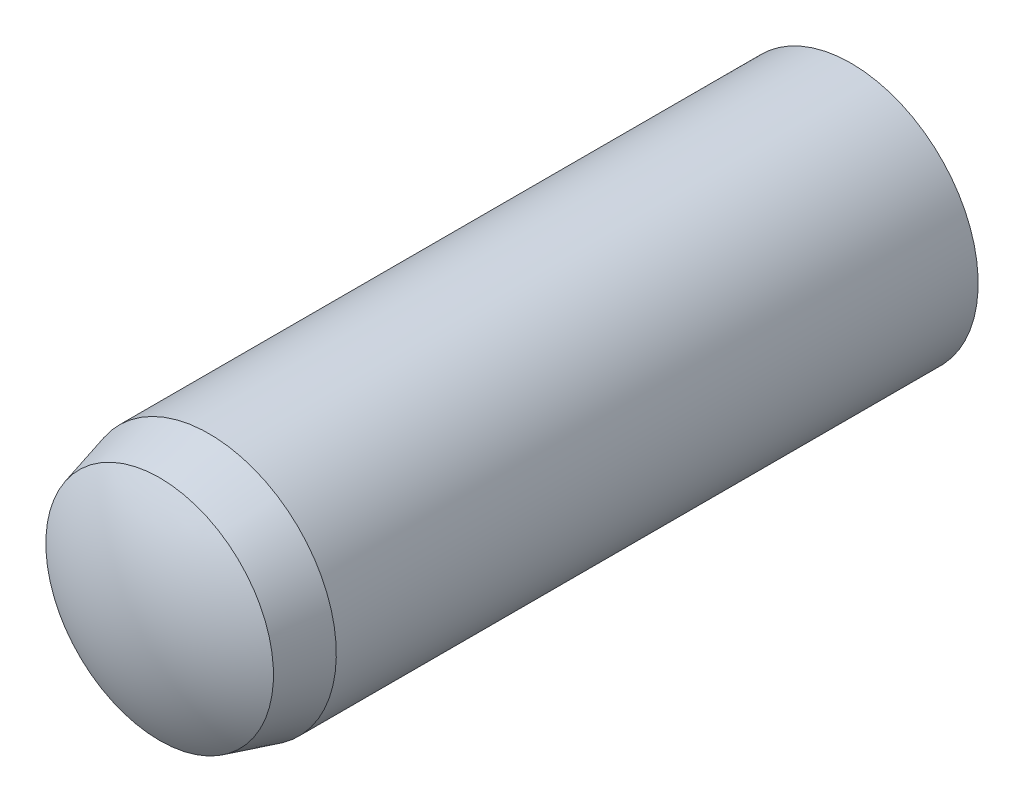
ISO-10303-21;
HEADER;
FILE_DESCRIPTION(('STEP AP214'),'2;1');
FILE_NAME('part.step','',(''),(''),'','','');
FILE_SCHEMA(('AUTOMOTIVE_DESIGN { 1 0 10303 214 1 1 1 1 }'));
ENDSEC;
DATA;
#1=APPLICATION_CONTEXT('core data for automotive mechanical design processes');
#2=APPLICATION_PROTOCOL_DEFINITION('international standard','automotive_design',2000,#1);
#3=PRODUCT_CONTEXT('',#1,'mechanical');
#4=PRODUCT('Part','Part','',(#3));
#5=PRODUCT_RELATED_PRODUCT_CATEGORY('part','',(#4));
#6=PRODUCT_DEFINITION_FORMATION('','',#4);
#7=PRODUCT_DEFINITION_CONTEXT('part definition',#1,'design');
#8=PRODUCT_DEFINITION('design','',#6,#7);
#9=PRODUCT_DEFINITION_SHAPE('','',#8);
#10=(LENGTH_UNIT() NAMED_UNIT(*) SI_UNIT(.MILLI.,.METRE.));
#11=(NAMED_UNIT(*) PLANE_ANGLE_UNIT() SI_UNIT($,.RADIAN.));
#12=(NAMED_UNIT(*) SI_UNIT($,.STERADIAN.) SOLID_ANGLE_UNIT());
#13=UNCERTAINTY_MEASURE_WITH_UNIT(LENGTH_MEASURE(1.E-05),#10,'distance_accuracy_value','');
#14=(GEOMETRIC_REPRESENTATION_CONTEXT(3) GLOBAL_UNCERTAINTY_ASSIGNED_CONTEXT((#13)) GLOBAL_UNIT_ASSIGNED_CONTEXT((#10,
#11,#12)) REPRESENTATION_CONTEXT('',''));
#15=CARTESIAN_POINT('',(0.,0.,0.));
#16=DIRECTION('',(0.,0.,1.));
#17=DIRECTION('',(1.,0.,0.));
#18=AXIS2_PLACEMENT_3D('',#15,#16,#17);
#19=CARTESIAN_POINT('',(0.,0.,-4.73333333333328));
#20=DIRECTION('',(0.,0.,1.));
#21=DIRECTION('',(0.,1.,0.));
#22=AXIS2_PLACEMENT_3D('',#19,#20,#21);
#23=SPHERICAL_SURFACE('',#22,7.26666666666672);
#24=CARTESIAN_POINT('',(0.,0.,-10.8));
#25=DIRECTION('',(0.,0.,1.));
#26=DIRECTION('',(0.,-1.,0.));
#27=AXIS2_PLACEMENT_3D('',#24,#25,#26);
#28=CIRCLE('',#27,4.);
#29=CARTESIAN_POINT('',(0.,-3.99999999999999,-10.8));
#30=VERTEX_POINT('',#29);
#31=EDGE_CURVE('E10',#30,#30,#28,.T.);
#32=ORIENTED_EDGE('',*,*,#31,.F.);
#33=EDGE_LOOP('',(#32));
#34=FACE_BOUND('',#33,.T.);
#35=ADVANCED_FACE('F30',(#34),#23,.T.);
#36=CARTESIAN_POINT('',(0.,0.,12.));
#37=DIRECTION('',(0.,0.,1.));
#38=DIRECTION('',(0.,-1.,0.));
#39=AXIS2_PLACEMENT_3D('',#36,#37,#38);
#40=CYLINDRICAL_SURFACE('',#39,4.);
#41=CARTESIAN_POINT('',(0.,0.,9.4));
#42=DIRECTION('',(0.,0.,1.));
#43=DIRECTION('',(0.,-1.,0.));
#44=AXIS2_PLACEMENT_3D('',#41,#42,#43);
#45=CIRCLE('',#44,4.);
#46=CARTESIAN_POINT('',(0.,-4.,9.4));
#47=VERTEX_POINT('',#46);
#48=EDGE_CURVE('E36',#47,#47,#45,.T.);
#49=ORIENTED_EDGE('',*,*,#48,.F.);
#50=EDGE_LOOP('',(#49));
#51=FACE_BOUND('',#50,.T.);
#52=ORIENTED_EDGE('',*,*,#31,.T.);
#53=EDGE_LOOP('',(#52));
#54=FACE_BOUND('',#53,.T.);
#55=ADVANCED_FACE('F51',(#51,#54),#40,.T.);
#56=CARTESIAN_POINT('',(0.,0.,9.4));
#57=DIRECTION('',(0.,0.,-1.));
#58=DIRECTION('',(0.,1.,0.));
#59=AXIS2_PLACEMENT_3D('',#56,#57,#58);
#60=CONICAL_SURFACE('',#59,4.,0.261799387799151);
#61=CARTESIAN_POINT('',(0.,0.,10.96));
#62=DIRECTION('',(0.,0.,1.));
#63=DIRECTION('',(0.,-1.,0.));
#64=AXIS2_PLACEMENT_3D('',#61,#62,#63);
#65=CIRCLE('',#64,3.58199925980745);
#66=CARTESIAN_POINT('',(0.,-3.58199925980745,10.96));
#67=VERTEX_POINT('',#66);
#68=EDGE_CURVE('E40',#67,#67,#65,.T.);
#69=ORIENTED_EDGE('',*,*,#68,.F.);
#70=EDGE_LOOP('',(#69));
#71=FACE_BOUND('',#70,.T.);
#72=ORIENTED_EDGE('',*,*,#48,.T.);
#73=EDGE_LOOP('',(#72));
#74=FACE_BOUND('',#73,.T.);
#75=ADVANCED_FACE('F49',(#71,#74),#60,.T.);
#76=CARTESIAN_POINT('',(0.,0.,5.31138524170138));
#77=DIRECTION('',(0.,0.,1.));
#78=DIRECTION('',(0.,1.,0.));
#79=AXIS2_PLACEMENT_3D('',#76,#77,#78);
#80=SPHERICAL_SURFACE('',#79,6.68861475829861);
#81=ORIENTED_EDGE('',*,*,#68,.T.);
#82=EDGE_LOOP('',(#81));
#83=FACE_BOUND('',#82,.T.);
#84=ADVANCED_FACE('F47',(#83),#80,.T.);
#85=CLOSED_SHELL('',(#35,#55,#75,#84));
#86=MANIFOLD_SOLID_BREP('B2',#85);
#87=ADVANCED_BREP_SHAPE_REPRESENTATION('',(#18,#86),#14);
#88=SHAPE_DEFINITION_REPRESENTATION(#9,#87);
ENDSEC;
END-ISO-10303-21;
